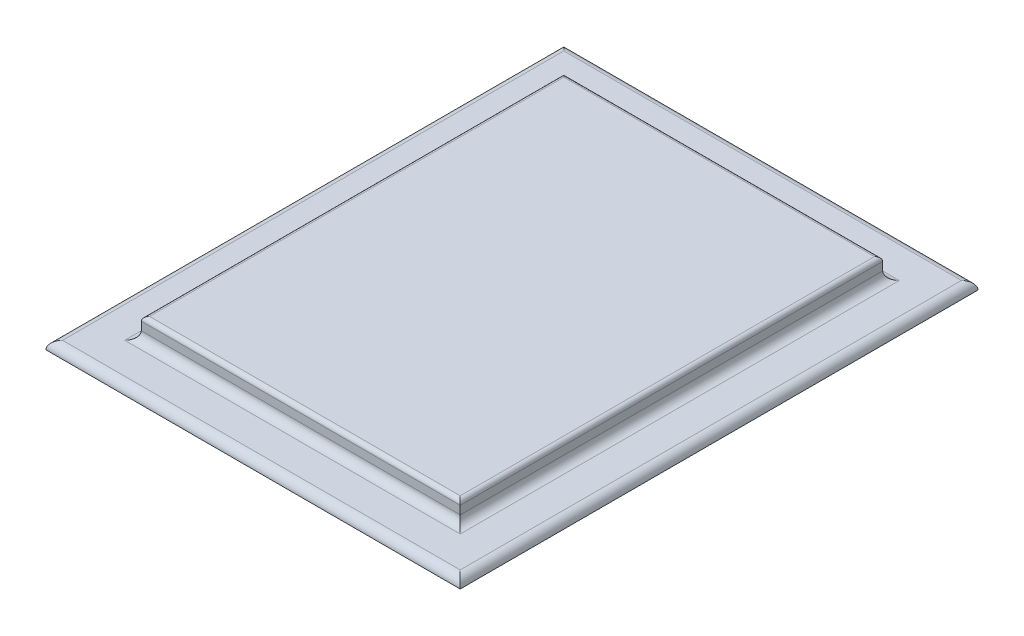
ISO-10303-21;
HEADER;
FILE_DESCRIPTION(('STEP AP214'),'2;1');
FILE_NAME('part.step','',(''),(''),'','','');
FILE_SCHEMA(('AUTOMOTIVE_DESIGN { 1 0 10303 214 1 1 1 1 }'));
ENDSEC;
DATA;
#1=APPLICATION_CONTEXT('core data for automotive mechanical design processes');
#2=APPLICATION_PROTOCOL_DEFINITION('international standard','automotive_design',2000,#1);
#3=PRODUCT_CONTEXT('',#1,'mechanical');
#4=PRODUCT('Part','Part','',(#3));
#5=PRODUCT_RELATED_PRODUCT_CATEGORY('part','',(#4));
#6=PRODUCT_DEFINITION_FORMATION('','',#4);
#7=PRODUCT_DEFINITION_CONTEXT('part definition',#1,'design');
#8=PRODUCT_DEFINITION('design','',#6,#7);
#9=PRODUCT_DEFINITION_SHAPE('','',#8);
#10=(LENGTH_UNIT() NAMED_UNIT(*) SI_UNIT(.MILLI.,.METRE.));
#11=(NAMED_UNIT(*) PLANE_ANGLE_UNIT() SI_UNIT($,.RADIAN.));
#12=(NAMED_UNIT(*) SI_UNIT($,.STERADIAN.) SOLID_ANGLE_UNIT());
#13=UNCERTAINTY_MEASURE_WITH_UNIT(LENGTH_MEASURE(1.E-05),#10,'distance_accuracy_value','');
#14=(GEOMETRIC_REPRESENTATION_CONTEXT(3) GLOBAL_UNCERTAINTY_ASSIGNED_CONTEXT((#13)) GLOBAL_UNIT_ASSIGNED_CONTEXT((#10,
#11,#12)) REPRESENTATION_CONTEXT('',''));
#15=CARTESIAN_POINT('',(0.,0.,0.));
#16=DIRECTION('',(0.,0.,1.));
#17=DIRECTION('',(1.,0.,0.));
#18=AXIS2_PLACEMENT_3D('',#15,#16,#17);
#19=CARTESIAN_POINT('',(0.,0.,0.));
#20=DIRECTION('',(0.,1.,0.));
#21=DIRECTION('',(0.,0.,1.));
#22=AXIS2_PLACEMENT_3D('',#19,#20,#21);
#23=PLANE('',#22);
#24=DIRECTION('',(0.,0.,1.));
#25=VECTOR('',#24,1.);
#26=CARTESIAN_POINT('',(2.38562091503268,0.,-13.1127450980392));
#27=LINE('',#26,#25);
#28=CARTESIAN_POINT('',(2.38562091503268,0.,-13.1127450980392));
#29=VERTEX_POINT('',#28);
#30=CARTESIAN_POINT('',(2.38562091503268,0.,11.8872549019608));
#31=VERTEX_POINT('',#30);
#32=EDGE_CURVE('E205',#29,#31,#27,.T.);
#33=ORIENTED_EDGE('',*,*,#32,.F.);
#34=DIRECTION('',(-1.,0.,0.));
#35=VECTOR('',#34,1.);
#36=CARTESIAN_POINT('',(2.38562091503268,0.,-13.1127450980392));
#37=LINE('',#36,#35);
#38=CARTESIAN_POINT('',(22.3856209150327,0.,-13.1127450980392));
#39=VERTEX_POINT('',#38);
#40=EDGE_CURVE('E213',#39,#29,#37,.T.);
#41=ORIENTED_EDGE('',*,*,#40,.F.);
#42=DIRECTION('',(0.,0.,-1.));
#43=VECTOR('',#42,1.);
#44=CARTESIAN_POINT('',(22.3856209150327,0.,-13.1127450980392));
#45=LINE('',#44,#43);
#46=CARTESIAN_POINT('',(22.3856209150327,0.,11.8872549019608));
#47=VERTEX_POINT('',#46);
#48=EDGE_CURVE('E210',#47,#39,#45,.T.);
#49=ORIENTED_EDGE('',*,*,#48,.F.);
#50=DIRECTION('',(1.,0.,0.));
#51=VECTOR('',#50,1.);
#52=CARTESIAN_POINT('',(2.38562091503268,0.,11.8872549019608));
#53=LINE('',#52,#51);
#54=EDGE_CURVE('E208',#31,#47,#53,.T.);
#55=ORIENTED_EDGE('',*,*,#54,.F.);
#56=EDGE_LOOP('',(#33,#41,#49,#55));
#57=FACE_BOUND('',#56,.T.);
#58=DIRECTION('',(0.,0.,-1.));
#59=VECTOR('',#58,1.);
#60=CARTESIAN_POINT('',(19.8856209150327,0.,9.38725490196079));
#61=LINE('',#60,#59);
#62=CARTESIAN_POINT('',(19.8856209150327,0.,9.38725490196079));
#63=VERTEX_POINT('',#62);
#64=CARTESIAN_POINT('',(19.8856209150327,0.,-10.6127450980392));
#65=VERTEX_POINT('',#64);
#66=EDGE_CURVE('E165',#63,#65,#61,.T.);
#67=ORIENTED_EDGE('',*,*,#66,.T.);
#68=DIRECTION('',(-1.,0.,0.));
#69=VECTOR('',#68,1.);
#70=CARTESIAN_POINT('',(19.8856209150327,0.,-10.6127450980392));
#71=LINE('',#70,#69);
#72=CARTESIAN_POINT('',(4.88562091503269,0.,-10.6127450980392));
#73=VERTEX_POINT('',#72);
#74=EDGE_CURVE('E175',#65,#73,#71,.T.);
#75=ORIENTED_EDGE('',*,*,#74,.T.);
#76=DIRECTION('',(0.,0.,-1.));
#77=VECTOR('',#76,1.);
#78=CARTESIAN_POINT('',(4.88562091503268,0.,9.38725490196078));
#79=LINE('',#78,#77);
#80=CARTESIAN_POINT('',(4.88562091503268,0.,9.38725490196078));
#81=VERTEX_POINT('',#80);
#82=EDGE_CURVE('E181',#81,#73,#79,.T.);
#83=ORIENTED_EDGE('',*,*,#82,.F.);
#84=DIRECTION('',(-1.,0.,0.));
#85=VECTOR('',#84,1.);
#86=CARTESIAN_POINT('',(19.8856209150327,0.,9.38725490196079));
#87=LINE('',#86,#85);
#88=EDGE_CURVE('E184',#63,#81,#87,.T.);
#89=ORIENTED_EDGE('',*,*,#88,.F.);
#90=EDGE_LOOP('',(#67,#75,#83,#89));
#91=FACE_BOUND('',#90,.T.);
#92=ADVANCED_FACE('F32',(#57,#91),#23,.F.);
#93=CARTESIAN_POINT('',(0.,0.4,0.));
#94=DIRECTION('',(0.,1.,0.));
#95=DIRECTION('',(0.,0.,1.));
#96=AXIS2_PLACEMENT_3D('',#93,#94,#95);
#97=PLANE('',#96);
#98=DIRECTION('',(0.,0.,1.));
#99=VECTOR('',#98,1.);
#100=CARTESIAN_POINT('',(2.78562091503268,0.4,11.8872549019608));
#101=LINE('',#100,#99);
#102=CARTESIAN_POINT('',(2.78562091503268,0.4,-12.7127450980392));
#103=VERTEX_POINT('',#102);
#104=CARTESIAN_POINT('',(2.78562091503268,0.4,11.4872549019608));
#105=VERTEX_POINT('',#104);
#106=EDGE_CURVE('E41',#103,#105,#101,.T.);
#107=ORIENTED_EDGE('',*,*,#106,.T.);
#108=DIRECTION('',(1.,0.,0.));
#109=VECTOR('',#108,1.);
#110=CARTESIAN_POINT('',(22.3856209150327,0.4,11.4872549019608));
#111=LINE('',#110,#109);
#112=CARTESIAN_POINT('',(21.9856209150327,0.4,11.4872549019608));
#113=VERTEX_POINT('',#112);
#114=EDGE_CURVE('E11',#105,#113,#111,.T.);
#115=ORIENTED_EDGE('',*,*,#114,.T.);
#116=DIRECTION('',(0.,0.,-1.));
#117=VECTOR('',#116,1.);
#118=CARTESIAN_POINT('',(21.9856209150327,0.4,-13.1127450980392));
#119=LINE('',#118,#117);
#120=CARTESIAN_POINT('',(21.9856209150327,0.4,-12.7127450980392));
#121=VERTEX_POINT('',#120);
#122=EDGE_CURVE('E301',#113,#121,#119,.T.);
#123=ORIENTED_EDGE('',*,*,#122,.T.);
#124=DIRECTION('',(-1.,0.,0.));
#125=VECTOR('',#124,1.);
#126=CARTESIAN_POINT('',(2.38562091503268,0.4,-12.7127450980392));
#127=LINE('',#126,#125);
#128=EDGE_CURVE('E290',#121,#103,#127,.T.);
#129=ORIENTED_EDGE('',*,*,#128,.T.);
#130=EDGE_LOOP('',(#107,#115,#123,#129));
#131=FACE_BOUND('',#130,.T.);
#132=DIRECTION('',(-1.,0.,0.));
#133=VECTOR('',#132,1.);
#134=CARTESIAN_POINT('',(0.,0.4,-11.2127450980392));
#135=LINE('',#134,#133);
#136=CARTESIAN_POINT('',(4.28562091503268,0.4,-11.2127450980392));
#137=VERTEX_POINT('',#136);
#138=CARTESIAN_POINT('',(20.4856209150327,0.4,-11.2127450980392));
#139=VERTEX_POINT('',#138);
#140=EDGE_CURVE('E219',#137,#139,#135,.F.);
#141=ORIENTED_EDGE('',*,*,#140,.T.);
#142=DIRECTION('',(0.,0.,-1.));
#143=VECTOR('',#142,1.);
#144=CARTESIAN_POINT('',(20.4856209150327,0.4,0.));
#145=LINE('',#144,#143);
#146=CARTESIAN_POINT('',(20.4856209150327,0.4,9.98725490196078));
#147=VERTEX_POINT('',#146);
#148=EDGE_CURVE('E225',#139,#147,#145,.F.);
#149=ORIENTED_EDGE('',*,*,#148,.T.);
#150=DIRECTION('',(1.,0.,0.));
#151=VECTOR('',#150,1.);
#152=CARTESIAN_POINT('',(0.,0.4,9.98725490196078));
#153=LINE('',#152,#151);
#154=CARTESIAN_POINT('',(4.28562091503268,0.4,9.98725490196078));
#155=VERTEX_POINT('',#154);
#156=EDGE_CURVE('E223',#147,#155,#153,.F.);
#157=ORIENTED_EDGE('',*,*,#156,.T.);
#158=DIRECTION('',(0.,0.,1.));
#159=VECTOR('',#158,1.);
#160=CARTESIAN_POINT('',(4.28562091503268,0.4,0.));
#161=LINE('',#160,#159);
#162=EDGE_CURVE('E221',#155,#137,#161,.F.);
#163=ORIENTED_EDGE('',*,*,#162,.T.);
#164=EDGE_LOOP('',(#141,#149,#157,#163));
#165=FACE_BOUND('',#164,.T.);
#166=ADVANCED_FACE('F320',(#131,#165),#97,.T.);
#167=CARTESIAN_POINT('',(4.68562091503268,1.4,9.58725490196078));
#168=DIRECTION('',(1.,0.,0.));
#169=DIRECTION('',(0.,0.,-1.));
#170=AXIS2_PLACEMENT_3D('',#167,#168,#169);
#171=PLANE('',#170);
#172=DIRECTION('',(0.,-1.,0.));
#173=VECTOR('',#172,1.);
#174=CARTESIAN_POINT('',(4.68562091503268,1.4,9.58725490196078));
#175=LINE('',#174,#173);
#176=CARTESIAN_POINT('',(4.68562091503268,1.2,9.58725490196078));
#177=VERTEX_POINT('',#176);
#178=CARTESIAN_POINT('',(4.68562091503268,0.8,9.58725490196078));
#179=VERTEX_POINT('',#178);
#180=EDGE_CURVE('E203',#177,#179,#175,.T.);
#181=ORIENTED_EDGE('',*,*,#180,.F.);
#182=DIRECTION('',(0.,0.,1.));
#183=VECTOR('',#182,1.);
#184=CARTESIAN_POINT('',(4.68562091503268,1.2,-10.8127450980392));
#185=LINE('',#184,#183);
#186=CARTESIAN_POINT('',(4.68562091503268,1.2,-10.8127450980392));
#187=VERTEX_POINT('',#186);
#188=EDGE_CURVE('E261',#177,#187,#185,.F.);
#189=ORIENTED_EDGE('',*,*,#188,.T.);
#190=DIRECTION('',(0.,-1.,0.));
#191=VECTOR('',#190,1.);
#192=CARTESIAN_POINT('',(4.68562091503268,1.4,-10.8127450980392));
#193=LINE('',#192,#191);
#194=CARTESIAN_POINT('',(4.68562091503268,0.8,-10.8127450980392));
#195=VERTEX_POINT('',#194);
#196=EDGE_CURVE('E171',#187,#195,#193,.T.);
#197=ORIENTED_EDGE('',*,*,#196,.T.);
#198=DIRECTION('',(0.,0.,1.));
#199=VECTOR('',#198,1.);
#200=CARTESIAN_POINT('',(4.68562091503268,0.8,9.58725490196078));
#201=LINE('',#200,#199);
#202=EDGE_CURVE('E231',#195,#179,#201,.T.);
#203=ORIENTED_EDGE('',*,*,#202,.T.);
#204=EDGE_LOOP('',(#181,#189,#197,#203));
#205=FACE_BOUND('',#204,.T.);
#206=ADVANCED_FACE('F323',(#205),#171,.F.);
#207=CARTESIAN_POINT('',(20.0856209150327,1.4,9.58725490196078));
#208=DIRECTION('',(0.,0.,-1.));
#209=DIRECTION('',(-1.,0.,0.));
#210=AXIS2_PLACEMENT_3D('',#207,#208,#209);
#211=PLANE('',#210);
#212=DIRECTION('',(0.,-1.,0.));
#213=VECTOR('',#212,1.);
#214=CARTESIAN_POINT('',(20.0856209150327,1.4,9.58725490196078));
#215=LINE('',#214,#213);
#216=CARTESIAN_POINT('',(20.0856209150327,1.2,9.58725490196078));
#217=VERTEX_POINT('',#216);
#218=CARTESIAN_POINT('',(20.0856209150327,0.8,9.58725490196078));
#219=VERTEX_POINT('',#218);
#220=EDGE_CURVE('E201',#217,#219,#215,.T.);
#221=ORIENTED_EDGE('',*,*,#220,.F.);
#222=DIRECTION('',(1.,0.,0.));
#223=VECTOR('',#222,1.);
#224=CARTESIAN_POINT('',(4.68562091503268,1.2,9.58725490196078));
#225=LINE('',#224,#223);
#226=EDGE_CURVE('E259',#217,#177,#225,.F.);
#227=ORIENTED_EDGE('',*,*,#226,.T.);
#228=ORIENTED_EDGE('',*,*,#180,.T.);
#229=DIRECTION('',(1.,0.,0.));
#230=VECTOR('',#229,1.);
#231=CARTESIAN_POINT('',(20.0856209150327,0.8,9.58725490196078));
#232=LINE('',#231,#230);
#233=EDGE_CURVE('E228',#179,#219,#232,.T.);
#234=ORIENTED_EDGE('',*,*,#233,.T.);
#235=EDGE_LOOP('',(#221,#227,#228,#234));
#236=FACE_BOUND('',#235,.T.);
#237=ADVANCED_FACE('F349',(#236),#211,.F.);
#238=CARTESIAN_POINT('',(20.0856209150327,1.4,9.58725490196078));
#239=DIRECTION('',(-1.,0.,0.));
#240=DIRECTION('',(0.,0.,1.));
#241=AXIS2_PLACEMENT_3D('',#238,#239,#240);
#242=PLANE('',#241);
#243=DIRECTION('',(0.,-1.,0.));
#244=VECTOR('',#243,1.);
#245=CARTESIAN_POINT('',(20.0856209150327,1.4,-10.8127450980392));
#246=LINE('',#245,#244);
#247=CARTESIAN_POINT('',(20.0856209150327,1.2,-10.8127450980392));
#248=VERTEX_POINT('',#247);
#249=CARTESIAN_POINT('',(20.0856209150327,0.8,-10.8127450980392));
#250=VERTEX_POINT('',#249);
#251=EDGE_CURVE('E199',#248,#250,#246,.T.);
#252=ORIENTED_EDGE('',*,*,#251,.F.);
#253=DIRECTION('',(0.,0.,-1.));
#254=VECTOR('',#253,1.);
#255=CARTESIAN_POINT('',(20.0856209150327,1.2,9.58725490196078));
#256=LINE('',#255,#254);
#257=EDGE_CURVE('E257',#248,#217,#256,.F.);
#258=ORIENTED_EDGE('',*,*,#257,.T.);
#259=ORIENTED_EDGE('',*,*,#220,.T.);
#260=DIRECTION('',(0.,0.,-1.));
#261=VECTOR('',#260,1.);
#262=CARTESIAN_POINT('',(20.0856209150327,0.8,9.58725490196078));
#263=LINE('',#262,#261);
#264=EDGE_CURVE('E216',#219,#250,#263,.T.);
#265=ORIENTED_EDGE('',*,*,#264,.T.);
#266=EDGE_LOOP('',(#252,#258,#259,#265));
#267=FACE_BOUND('',#266,.T.);
#268=ADVANCED_FACE('F343',(#267),#242,.F.);
#269=CARTESIAN_POINT('',(20.0856209150327,1.4,-10.8127450980392));
#270=DIRECTION('',(0.,0.,1.));
#271=DIRECTION('',(1.,0.,0.));
#272=AXIS2_PLACEMENT_3D('',#269,#270,#271);
#273=PLANE('',#272);
#274=ORIENTED_EDGE('',*,*,#196,.F.);
#275=DIRECTION('',(-1.,0.,0.));
#276=VECTOR('',#275,1.);
#277=CARTESIAN_POINT('',(20.0856209150327,1.2,-10.8127450980392));
#278=LINE('',#277,#276);
#279=EDGE_CURVE('E254',#187,#248,#278,.F.);
#280=ORIENTED_EDGE('',*,*,#279,.T.);
#281=ORIENTED_EDGE('',*,*,#251,.T.);
#282=DIRECTION('',(-1.,0.,0.));
#283=VECTOR('',#282,1.);
#284=CARTESIAN_POINT('',(20.0856209150327,0.8,-10.8127450980392));
#285=LINE('',#284,#283);
#286=EDGE_CURVE('E234',#250,#195,#285,.T.);
#287=ORIENTED_EDGE('',*,*,#286,.T.);
#288=EDGE_LOOP('',(#274,#280,#281,#287));
#289=FACE_BOUND('',#288,.T.);
#290=ADVANCED_FACE('F360',(#289),#273,.F.);
#291=CARTESIAN_POINT('',(0.,1.4,0.));
#292=DIRECTION('',(0.,1.,0.));
#293=DIRECTION('',(0.,0.,1.));
#294=AXIS2_PLACEMENT_3D('',#291,#292,#293);
#295=PLANE('',#294);
#296=DIRECTION('',(0.,0.,-1.));
#297=VECTOR('',#296,1.);
#298=CARTESIAN_POINT('',(19.8856209150327,1.4,-10.8127450980392));
#299=LINE('',#298,#297);
#300=CARTESIAN_POINT('',(19.8856209150327,1.4,9.38725490196078));
#301=VERTEX_POINT('',#300);
#302=CARTESIAN_POINT('',(19.8856209150327,1.4,-10.6127450980392));
#303=VERTEX_POINT('',#302);
#304=EDGE_CURVE('E249',#301,#303,#299,.T.);
#305=ORIENTED_EDGE('',*,*,#304,.T.);
#306=DIRECTION('',(-1.,0.,0.));
#307=VECTOR('',#306,1.);
#308=CARTESIAN_POINT('',(4.68562091503268,1.4,-10.6127450980392));
#309=LINE('',#308,#307);
#310=CARTESIAN_POINT('',(4.88562091503268,1.4,-10.6127450980392));
#311=VERTEX_POINT('',#310);
#312=EDGE_CURVE('E251',#303,#311,#309,.T.);
#313=ORIENTED_EDGE('',*,*,#312,.T.);
#314=DIRECTION('',(0.,0.,1.));
#315=VECTOR('',#314,1.);
#316=CARTESIAN_POINT('',(4.88562091503268,1.4,9.58725490196078));
#317=LINE('',#316,#315);
#318=CARTESIAN_POINT('',(4.88562091503268,1.4,9.38725490196078));
#319=VERTEX_POINT('',#318);
#320=EDGE_CURVE('E237',#311,#319,#317,.T.);
#321=ORIENTED_EDGE('',*,*,#320,.T.);
#322=DIRECTION('',(1.,0.,0.));
#323=VECTOR('',#322,1.);
#324=CARTESIAN_POINT('',(20.0856209150327,1.4,9.38725490196078));
#325=LINE('',#324,#323);
#326=EDGE_CURVE('E247',#319,#301,#325,.T.);
#327=ORIENTED_EDGE('',*,*,#326,.T.);
#328=EDGE_LOOP('',(#305,#313,#321,#327));
#329=FACE_BOUND('',#328,.T.);
#330=ADVANCED_FACE('F371',(#329),#295,.T.);
#331=CARTESIAN_POINT('',(19.8856209150327,1.,9.38725490196079));
#332=DIRECTION('',(-1.,0.,0.));
#333=DIRECTION('',(0.,0.,1.));
#334=AXIS2_PLACEMENT_3D('',#331,#332,#333);
#335=PLANE('',#334);
#336=DIRECTION('',(0.,-1.,0.));
#337=VECTOR('',#336,1.);
#338=CARTESIAN_POINT('',(19.8856209150327,1.,9.38725490196079));
#339=LINE('',#338,#337);
#340=CARTESIAN_POINT('',(19.8856209150327,0.5,9.38725490196079));
#341=VERTEX_POINT('',#340);
#342=EDGE_CURVE('E193',#341,#63,#339,.T.);
#343=ORIENTED_EDGE('',*,*,#342,.F.);
#344=DIRECTION('',(0.,0.,-1.));
#345=VECTOR('',#344,1.);
#346=CARTESIAN_POINT('',(19.8856209150327,0.5,9.38725490196079));
#347=LINE('',#346,#345);
#348=CARTESIAN_POINT('',(19.8856209150327,0.5,-10.6127450980392));
#349=VERTEX_POINT('',#348);
#350=EDGE_CURVE('E168',#341,#349,#347,.T.);
#351=ORIENTED_EDGE('',*,*,#350,.T.);
#352=DIRECTION('',(0.,-1.,0.));
#353=VECTOR('',#352,1.);
#354=CARTESIAN_POINT('',(19.8856209150327,1.,-10.6127450980392));
#355=LINE('',#354,#353);
#356=EDGE_CURVE('E160',#349,#65,#355,.T.);
#357=ORIENTED_EDGE('',*,*,#356,.T.);
#358=ORIENTED_EDGE('',*,*,#66,.F.);
#359=EDGE_LOOP('',(#343,#351,#357,#358));
#360=FACE_BOUND('',#359,.T.);
#361=ADVANCED_FACE('F163',(#360),#335,.T.);
#362=CARTESIAN_POINT('',(19.8856209150327,1.,-10.6127450980392));
#363=DIRECTION('',(0.,0.,1.));
#364=DIRECTION('',(1.,0.,0.));
#365=AXIS2_PLACEMENT_3D('',#362,#363,#364);
#366=PLANE('',#365);
#367=ORIENTED_EDGE('',*,*,#356,.F.);
#368=DIRECTION('',(-1.,0.,0.));
#369=VECTOR('',#368,1.);
#370=CARTESIAN_POINT('',(19.8856209150327,0.5,-10.6127450980392));
#371=LINE('',#370,#369);
#372=CARTESIAN_POINT('',(4.88562091503269,0.5,-10.6127450980392));
#373=VERTEX_POINT('',#372);
#374=EDGE_CURVE('E288',#349,#373,#371,.T.);
#375=ORIENTED_EDGE('',*,*,#374,.T.);
#376=DIRECTION('',(0.,-1.,0.));
#377=VECTOR('',#376,1.);
#378=CARTESIAN_POINT('',(4.88562091503269,1.,-10.6127450980392));
#379=LINE('',#378,#377);
#380=EDGE_CURVE('E172',#373,#73,#379,.T.);
#381=ORIENTED_EDGE('',*,*,#380,.T.);
#382=ORIENTED_EDGE('',*,*,#74,.F.);
#383=EDGE_LOOP('',(#367,#375,#381,#382));
#384=FACE_BOUND('',#383,.T.);
#385=ADVANCED_FACE('F176',(#384),#366,.T.);
#386=CARTESIAN_POINT('',(4.88562091503268,1.,9.38725490196078));
#387=DIRECTION('',(-1.,0.,0.));
#388=DIRECTION('',(0.,0.,1.));
#389=AXIS2_PLACEMENT_3D('',#386,#387,#388);
#390=PLANE('',#389);
#391=ORIENTED_EDGE('',*,*,#380,.F.);
#392=DIRECTION('',(0.,0.,-1.));
#393=VECTOR('',#392,1.);
#394=CARTESIAN_POINT('',(4.88562091503268,0.5,9.38725490196078));
#395=LINE('',#394,#393);
#396=CARTESIAN_POINT('',(4.88562091503268,0.5,9.38725490196078));
#397=VERTEX_POINT('',#396);
#398=EDGE_CURVE('E286',#373,#397,#395,.F.);
#399=ORIENTED_EDGE('',*,*,#398,.T.);
#400=DIRECTION('',(0.,-1.,0.));
#401=VECTOR('',#400,1.);
#402=CARTESIAN_POINT('',(4.88562091503268,1.,9.38725490196078));
#403=LINE('',#402,#401);
#404=EDGE_CURVE('E195',#397,#81,#403,.T.);
#405=ORIENTED_EDGE('',*,*,#404,.T.);
#406=ORIENTED_EDGE('',*,*,#82,.T.);
#407=EDGE_LOOP('',(#391,#399,#405,#406));
#408=FACE_BOUND('',#407,.T.);
#409=ADVANCED_FACE('F533',(#408),#390,.F.);
#410=CARTESIAN_POINT('',(19.8856209150327,1.,9.38725490196079));
#411=DIRECTION('',(0.,0.,1.));
#412=DIRECTION('',(1.,0.,0.));
#413=AXIS2_PLACEMENT_3D('',#410,#411,#412);
#414=PLANE('',#413);
#415=ORIENTED_EDGE('',*,*,#404,.F.);
#416=DIRECTION('',(-1.,0.,0.));
#417=VECTOR('',#416,1.);
#418=CARTESIAN_POINT('',(19.8856209150327,0.5,9.38725490196079));
#419=LINE('',#418,#417);
#420=EDGE_CURVE('E282',#397,#341,#419,.F.);
#421=ORIENTED_EDGE('',*,*,#420,.T.);
#422=ORIENTED_EDGE('',*,*,#342,.T.);
#423=ORIENTED_EDGE('',*,*,#88,.T.);
#424=EDGE_LOOP('',(#415,#421,#422,#423));
#425=FACE_BOUND('',#424,.T.);
#426=ADVANCED_FACE('F524',(#425),#414,.F.);
#427=CARTESIAN_POINT('',(0.,1.,0.));
#428=DIRECTION('',(0.,1.,0.));
#429=DIRECTION('',(0.,0.,1.));
#430=AXIS2_PLACEMENT_3D('',#427,#428,#429);
#431=PLANE('',#430);
#432=DIRECTION('',(0.,0.,-1.));
#433=VECTOR('',#432,1.);
#434=CARTESIAN_POINT('',(19.3856209150327,1.,0.));
#435=LINE('',#434,#433);
#436=CARTESIAN_POINT('',(19.3856209150327,1.,-10.1127450980392));
#437=VERTEX_POINT('',#436);
#438=CARTESIAN_POINT('',(19.3856209150327,1.,8.88725490196078));
#439=VERTEX_POINT('',#438);
#440=EDGE_CURVE('E277',#437,#439,#435,.F.);
#441=ORIENTED_EDGE('',*,*,#440,.T.);
#442=DIRECTION('',(-1.,0.,0.));
#443=VECTOR('',#442,1.);
#444=CARTESIAN_POINT('',(4.88562091503268,1.,8.88725490196078));
#445=LINE('',#444,#443);
#446=CARTESIAN_POINT('',(5.38562091503268,1.,8.88725490196078));
#447=VERTEX_POINT('',#446);
#448=EDGE_CURVE('E279',#439,#447,#445,.T.);
#449=ORIENTED_EDGE('',*,*,#448,.T.);
#450=DIRECTION('',(0.,0.,-1.));
#451=VECTOR('',#450,1.);
#452=CARTESIAN_POINT('',(5.38562091503268,1.,-10.6127450980392));
#453=LINE('',#452,#451);
#454=CARTESIAN_POINT('',(5.38562091503268,1.,-10.1127450980392));
#455=VERTEX_POINT('',#454);
#456=EDGE_CURVE('E275',#447,#455,#453,.T.);
#457=ORIENTED_EDGE('',*,*,#456,.T.);
#458=DIRECTION('',(-1.,0.,0.));
#459=VECTOR('',#458,1.);
#460=CARTESIAN_POINT('',(0.,1.,-10.1127450980392));
#461=LINE('',#460,#459);
#462=EDGE_CURVE('E263',#455,#437,#461,.F.);
#463=ORIENTED_EDGE('',*,*,#462,.T.);
#464=EDGE_LOOP('',(#441,#449,#457,#463));
#465=FACE_BOUND('',#464,.T.);
#466=ADVANCED_FACE('F399',(#465),#431,.F.);
#467=CARTESIAN_POINT('',(4.28562091503268,0.8,9.58725490196078));
#468=DIRECTION('',(0.,0.,1.));
#469=DIRECTION('',(1.,0.,0.));
#470=AXIS2_PLACEMENT_3D('',#467,#468,#469);
#471=CYLINDRICAL_SURFACE('',#470,0.4);
#472=CARTESIAN_POINT('',(4.28562091503269,0.8,-11.2127450980392));
#473=DIRECTION('',(-0.707106781186547,0.,0.707106781186548));
#474=DIRECTION('',(-0.707106781186548,0.,-0.707106781186547));
#475=AXIS2_PLACEMENT_3D('',#472,#473,#474);
#476=ELLIPSE('',#475,0.565685424949238,0.4);
#477=EDGE_CURVE('E188',#137,#195,#476,.T.);
#478=ORIENTED_EDGE('',*,*,#477,.F.);
#479=ORIENTED_EDGE('',*,*,#162,.F.);
#480=CARTESIAN_POINT('',(4.28562091503269,0.8,9.98725490196078));
#481=DIRECTION('',(0.707106781186548,0.,0.707106781186547));
#482=DIRECTION('',(-0.707106781186547,0.,0.707106781186548));
#483=AXIS2_PLACEMENT_3D('',#480,#481,#482);
#484=ELLIPSE('',#483,0.565685424949238,0.4);
#485=EDGE_CURVE('E185',#179,#155,#484,.F.);
#486=ORIENTED_EDGE('',*,*,#485,.F.);
#487=ORIENTED_EDGE('',*,*,#202,.F.);
#488=EDGE_LOOP('',(#478,#479,#486,#487));
#489=FACE_BOUND('',#488,.T.);
#490=ADVANCED_FACE('F355',(#489),#471,.F.);
#491=CARTESIAN_POINT('',(20.0856209150327,0.8,9.98725490196078));
#492=DIRECTION('',(1.,0.,0.));
#493=DIRECTION('',(0.,0.,-1.));
#494=AXIS2_PLACEMENT_3D('',#491,#492,#493);
#495=CYLINDRICAL_SURFACE('',#494,0.4);
#496=ORIENTED_EDGE('',*,*,#485,.T.);
#497=ORIENTED_EDGE('',*,*,#156,.F.);
#498=CARTESIAN_POINT('',(20.4856209150327,0.8,9.98725490196078));
#499=DIRECTION('',(0.707106781186547,0.,-0.707106781186548));
#500=DIRECTION('',(0.707106781186548,0.,0.707106781186547));
#501=AXIS2_PLACEMENT_3D('',#498,#499,#500);
#502=ELLIPSE('',#501,0.565685424949238,0.4);
#503=EDGE_CURVE('E241',#219,#147,#502,.F.);
#504=ORIENTED_EDGE('',*,*,#503,.F.);
#505=ORIENTED_EDGE('',*,*,#233,.F.);
#506=EDGE_LOOP('',(#496,#497,#504,#505));
#507=FACE_BOUND('',#506,.T.);
#508=ADVANCED_FACE('F352',(#507),#495,.F.);
#509=CARTESIAN_POINT('',(20.0856209150327,0.8,-11.2127450980392));
#510=DIRECTION('',(-1.,0.,0.));
#511=DIRECTION('',(0.,0.,1.));
#512=AXIS2_PLACEMENT_3D('',#509,#510,#511);
#513=CYLINDRICAL_SURFACE('',#512,0.4);
#514=ORIENTED_EDGE('',*,*,#477,.T.);
#515=ORIENTED_EDGE('',*,*,#286,.F.);
#516=CARTESIAN_POINT('',(20.4856209150327,0.8,-11.2127450980392));
#517=DIRECTION('',(-0.707106781186548,0.,-0.707106781186547));
#518=DIRECTION('',(-0.707106781186547,0.,0.707106781186548));
#519=AXIS2_PLACEMENT_3D('',#516,#517,#518);
#520=ELLIPSE('',#519,0.565685424949238,0.4);
#521=EDGE_CURVE('E238',#139,#250,#520,.T.);
#522=ORIENTED_EDGE('',*,*,#521,.F.);
#523=ORIENTED_EDGE('',*,*,#140,.F.);
#524=EDGE_LOOP('',(#514,#515,#522,#523));
#525=FACE_BOUND('',#524,.T.);
#526=ADVANCED_FACE('F337',(#525),#513,.F.);
#527=CARTESIAN_POINT('',(20.4856209150327,0.8,9.58725490196078));
#528=DIRECTION('',(0.,0.,-1.));
#529=DIRECTION('',(-1.,0.,0.));
#530=AXIS2_PLACEMENT_3D('',#527,#528,#529);
#531=CYLINDRICAL_SURFACE('',#530,0.4);
#532=ORIENTED_EDGE('',*,*,#503,.T.);
#533=ORIENTED_EDGE('',*,*,#148,.F.);
#534=ORIENTED_EDGE('',*,*,#521,.T.);
#535=ORIENTED_EDGE('',*,*,#264,.F.);
#536=EDGE_LOOP('',(#532,#533,#534,#535));
#537=FACE_BOUND('',#536,.T.);
#538=ADVANCED_FACE('F332',(#537),#531,.F.);
#539=CARTESIAN_POINT('',(0.,1.2,9.38725490196078));
#540=DIRECTION('',(-1.,0.,0.));
#541=DIRECTION('',(0.,0.,1.));
#542=AXIS2_PLACEMENT_3D('',#539,#540,#541);
#543=CYLINDRICAL_SURFACE('',#542,0.2);
#544=CARTESIAN_POINT('',(4.88562091503268,1.2,9.38725490196078));
#545=DIRECTION('',(-0.707106781186548,0.,-0.707106781186547));
#546=DIRECTION('',(0.707106781186547,0.,-0.707106781186548));
#547=AXIS2_PLACEMENT_3D('',#544,#545,#546);
#548=ELLIPSE('',#547,0.282842712474619,0.2);
#549=EDGE_CURVE('E269',#177,#319,#548,.T.);
#550=ORIENTED_EDGE('',*,*,#549,.F.);
#551=ORIENTED_EDGE('',*,*,#226,.F.);
#552=CARTESIAN_POINT('',(19.8856209150327,1.2,9.38725490196078));
#553=DIRECTION('',(-0.707106781186547,0.,0.707106781186548));
#554=DIRECTION('',(-0.707106781186548,0.,-0.707106781186547));
#555=AXIS2_PLACEMENT_3D('',#552,#553,#554);
#556=ELLIPSE('',#555,0.282842712474619,0.2);
#557=EDGE_CURVE('E242',#301,#217,#556,.F.);
#558=ORIENTED_EDGE('',*,*,#557,.F.);
#559=ORIENTED_EDGE('',*,*,#326,.F.);
#560=EDGE_LOOP('',(#550,#551,#558,#559));
#561=FACE_BOUND('',#560,.T.);
#562=ADVANCED_FACE('F377',(#561),#543,.T.);
#563=CARTESIAN_POINT('',(19.8856209150327,1.2,0.));
#564=DIRECTION('',(0.,0.,1.));
#565=DIRECTION('',(1.,0.,0.));
#566=AXIS2_PLACEMENT_3D('',#563,#564,#565);
#567=CYLINDRICAL_SURFACE('',#566,0.2);
#568=ORIENTED_EDGE('',*,*,#557,.T.);
#569=ORIENTED_EDGE('',*,*,#257,.F.);
#570=CARTESIAN_POINT('',(19.8856209150327,1.2,-10.6127450980392));
#571=DIRECTION('',(0.707106781186548,0.,0.707106781186547));
#572=DIRECTION('',(-0.707106781186547,0.,0.707106781186548));
#573=AXIS2_PLACEMENT_3D('',#570,#571,#572);
#574=ELLIPSE('',#573,0.282842712474619,0.2);
#575=EDGE_CURVE('E266',#303,#248,#574,.F.);
#576=ORIENTED_EDGE('',*,*,#575,.F.);
#577=ORIENTED_EDGE('',*,*,#304,.F.);
#578=EDGE_LOOP('',(#568,#569,#576,#577));
#579=FACE_BOUND('',#578,.T.);
#580=ADVANCED_FACE('F375',(#579),#567,.T.);
#581=CARTESIAN_POINT('',(4.88562091503268,1.2,0.));
#582=DIRECTION('',(0.,0.,-1.));
#583=DIRECTION('',(-1.,0.,0.));
#584=AXIS2_PLACEMENT_3D('',#581,#582,#583);
#585=CYLINDRICAL_SURFACE('',#584,0.2);
#586=ORIENTED_EDGE('',*,*,#549,.T.);
#587=ORIENTED_EDGE('',*,*,#320,.F.);
#588=CARTESIAN_POINT('',(4.88562091503268,1.2,-10.6127450980392));
#589=DIRECTION('',(0.707106781186547,0.,-0.707106781186548));
#590=DIRECTION('',(-0.707106781186548,0.,-0.707106781186547));
#591=AXIS2_PLACEMENT_3D('',#588,#589,#590);
#592=ELLIPSE('',#591,0.282842712474619,0.2);
#593=EDGE_CURVE('E264',#187,#311,#592,.T.);
#594=ORIENTED_EDGE('',*,*,#593,.F.);
#595=ORIENTED_EDGE('',*,*,#188,.F.);
#596=EDGE_LOOP('',(#586,#587,#594,#595));
#597=FACE_BOUND('',#596,.T.);
#598=ADVANCED_FACE('F368',(#597),#585,.T.);
#599=CARTESIAN_POINT('',(0.,1.2,-10.6127450980392));
#600=DIRECTION('',(1.,0.,0.));
#601=DIRECTION('',(0.,0.,-1.));
#602=AXIS2_PLACEMENT_3D('',#599,#600,#601);
#603=CYLINDRICAL_SURFACE('',#602,0.2);
#604=ORIENTED_EDGE('',*,*,#575,.T.);
#605=ORIENTED_EDGE('',*,*,#279,.F.);
#606=ORIENTED_EDGE('',*,*,#593,.T.);
#607=ORIENTED_EDGE('',*,*,#312,.F.);
#608=EDGE_LOOP('',(#604,#605,#606,#607));
#609=FACE_BOUND('',#608,.T.);
#610=ADVANCED_FACE('F363',(#609),#603,.T.);
#611=CARTESIAN_POINT('',(19.8856209150327,0.5,-10.1127450980392));
#612=DIRECTION('',(-1.,0.,0.));
#613=DIRECTION('',(0.,0.,1.));
#614=AXIS2_PLACEMENT_3D('',#611,#612,#613);
#615=CYLINDRICAL_SURFACE('',#614,0.5);
#616=CARTESIAN_POINT('',(5.38562091503269,0.5,-10.1127450980392));
#617=DIRECTION('',(-0.707106781186548,0.,0.707106781186547));
#618=DIRECTION('',(0.707106781186547,0.,0.707106781186548));
#619=AXIS2_PLACEMENT_3D('',#616,#617,#618);
#620=ELLIPSE('',#619,0.707106781186547,0.5);
#621=EDGE_CURVE('E295',#373,#455,#620,.F.);
#622=ORIENTED_EDGE('',*,*,#621,.F.);
#623=ORIENTED_EDGE('',*,*,#374,.F.);
#624=CARTESIAN_POINT('',(19.3856209150327,0.5,-10.1127450980392));
#625=DIRECTION('',(-0.707106781186548,0.,-0.707106781186547));
#626=DIRECTION('',(0.707106781186547,0.,-0.707106781186548));
#627=AXIS2_PLACEMENT_3D('',#624,#625,#626);
#628=ELLIPSE('',#627,0.707106781186547,0.5);
#629=EDGE_CURVE('E267',#437,#349,#628,.T.);
#630=ORIENTED_EDGE('',*,*,#629,.F.);
#631=ORIENTED_EDGE('',*,*,#462,.F.);
#632=EDGE_LOOP('',(#622,#623,#630,#631));
#633=FACE_BOUND('',#632,.T.);
#634=ADVANCED_FACE('F402',(#633),#615,.F.);
#635=CARTESIAN_POINT('',(19.3856209150327,0.5,9.38725490196079));
#636=DIRECTION('',(0.,0.,-1.));
#637=DIRECTION('',(-1.,0.,0.));
#638=AXIS2_PLACEMENT_3D('',#635,#636,#637);
#639=CYLINDRICAL_SURFACE('',#638,0.5);
#640=ORIENTED_EDGE('',*,*,#629,.T.);
#641=ORIENTED_EDGE('',*,*,#350,.F.);
#642=CARTESIAN_POINT('',(19.3856209150327,0.5,8.88725490196078));
#643=DIRECTION('',(0.707106781186547,0.,-0.707106781186547));
#644=DIRECTION('',(0.707106781186547,0.,0.707106781186547));
#645=AXIS2_PLACEMENT_3D('',#642,#643,#644);
#646=ELLIPSE('',#645,0.707106781186548,0.5);
#647=EDGE_CURVE('E293',#439,#341,#646,.T.);
#648=ORIENTED_EDGE('',*,*,#647,.F.);
#649=ORIENTED_EDGE('',*,*,#440,.F.);
#650=EDGE_LOOP('',(#640,#641,#648,#649));
#651=FACE_BOUND('',#650,.T.);
#652=ADVANCED_FACE('F419',(#651),#639,.F.);
#653=CARTESIAN_POINT('',(5.38562091503268,0.5,0.));
#654=DIRECTION('',(0.,0.,1.));
#655=DIRECTION('',(1.,0.,0.));
#656=AXIS2_PLACEMENT_3D('',#653,#654,#655);
#657=CYLINDRICAL_SURFACE('',#656,0.5);
#658=ORIENTED_EDGE('',*,*,#621,.T.);
#659=ORIENTED_EDGE('',*,*,#456,.F.);
#660=CARTESIAN_POINT('',(5.38562091503268,0.5,8.88725490196078));
#661=DIRECTION('',(0.707106781186547,0.,0.707106781186548));
#662=DIRECTION('',(0.707106781186548,0.,-0.707106781186547));
#663=AXIS2_PLACEMENT_3D('',#660,#661,#662);
#664=ELLIPSE('',#663,0.707106781186547,0.5);
#665=EDGE_CURVE('E291',#397,#447,#664,.F.);
#666=ORIENTED_EDGE('',*,*,#665,.F.);
#667=ORIENTED_EDGE('',*,*,#398,.F.);
#668=EDGE_LOOP('',(#658,#659,#666,#667));
#669=FACE_BOUND('',#668,.T.);
#670=ADVANCED_FACE('F428',(#669),#657,.F.);
#671=CARTESIAN_POINT('',(0.,0.5,8.88725490196078));
#672=DIRECTION('',(1.,0.,0.));
#673=DIRECTION('',(0.,0.,-1.));
#674=AXIS2_PLACEMENT_3D('',#671,#672,#673);
#675=CYLINDRICAL_SURFACE('',#674,0.5);
#676=ORIENTED_EDGE('',*,*,#647,.T.);
#677=ORIENTED_EDGE('',*,*,#420,.F.);
#678=ORIENTED_EDGE('',*,*,#665,.T.);
#679=ORIENTED_EDGE('',*,*,#448,.F.);
#680=EDGE_LOOP('',(#676,#677,#678,#679));
#681=FACE_BOUND('',#680,.T.);
#682=ADVANCED_FACE('F436',(#681),#675,.F.);
#683=CARTESIAN_POINT('',(0.,0.,-12.7127450980392));
#684=DIRECTION('',(1.,0.,0.));
#685=DIRECTION('',(0.,0.,-1.));
#686=AXIS2_PLACEMENT_3D('',#683,#684,#685);
#687=CYLINDRICAL_SURFACE('',#686,0.4);
#688=CARTESIAN_POINT('',(21.9856209150327,0.,-12.7127450980392));
#689=DIRECTION('',(0.707106781186548,0.,0.707106781186547));
#690=DIRECTION('',(0.707106781186547,0.,-0.707106781186547));
#691=AXIS2_PLACEMENT_3D('',#688,#689,#690);
#692=ELLIPSE('',#691,0.565685424949238,0.4);
#693=EDGE_CURVE('E306',#39,#121,#692,.T.);
#694=ORIENTED_EDGE('',*,*,#693,.F.);
#695=ORIENTED_EDGE('',*,*,#40,.T.);
#696=CARTESIAN_POINT('',(2.78562091503268,0.,-12.7127450980392));
#697=DIRECTION('',(0.707106781186547,0.,-0.707106781186547));
#698=DIRECTION('',(0.707106781186548,0.,0.707106781186547));
#699=AXIS2_PLACEMENT_3D('',#696,#697,#698);
#700=ELLIPSE('',#699,0.565685424949238,0.4);
#701=EDGE_CURVE('E36',#103,#29,#700,.F.);
#702=ORIENTED_EDGE('',*,*,#701,.F.);
#703=ORIENTED_EDGE('',*,*,#128,.F.);
#704=EDGE_LOOP('',(#694,#695,#702,#703));
#705=FACE_BOUND('',#704,.T.);
#706=ADVANCED_FACE('F34',(#705),#687,.T.);
#707=CARTESIAN_POINT('',(2.78562091503268,0.,0.));
#708=DIRECTION('',(0.,0.,-1.));
#709=DIRECTION('',(-1.,0.,0.));
#710=AXIS2_PLACEMENT_3D('',#707,#708,#709);
#711=CYLINDRICAL_SURFACE('',#710,0.4);
#712=ORIENTED_EDGE('',*,*,#701,.T.);
#713=ORIENTED_EDGE('',*,*,#32,.T.);
#714=CARTESIAN_POINT('',(2.78562091503268,0.,11.4872549019608));
#715=DIRECTION('',(-0.707106781186547,0.,-0.707106781186547));
#716=DIRECTION('',(0.707106781186547,0.,-0.707106781186547));
#717=AXIS2_PLACEMENT_3D('',#714,#715,#716);
#718=ELLIPSE('',#717,0.565685424949238,0.4);
#719=EDGE_CURVE('E305',#105,#31,#718,.F.);
#720=ORIENTED_EDGE('',*,*,#719,.F.);
#721=ORIENTED_EDGE('',*,*,#106,.F.);
#722=EDGE_LOOP('',(#712,#713,#720,#721));
#723=FACE_BOUND('',#722,.T.);
#724=ADVANCED_FACE('F313',(#723),#711,.T.);
#725=CARTESIAN_POINT('',(21.9856209150327,0.,0.));
#726=DIRECTION('',(0.,0.,1.));
#727=DIRECTION('',(1.,0.,0.));
#728=AXIS2_PLACEMENT_3D('',#725,#726,#727);
#729=CYLINDRICAL_SURFACE('',#728,0.4);
#730=ORIENTED_EDGE('',*,*,#693,.T.);
#731=ORIENTED_EDGE('',*,*,#122,.F.);
#732=CARTESIAN_POINT('',(21.9856209150327,0.,11.4872549019608));
#733=DIRECTION('',(-0.707106781186547,0.,0.707106781186547));
#734=DIRECTION('',(0.707106781186547,0.,0.707106781186547));
#735=AXIS2_PLACEMENT_3D('',#732,#733,#734);
#736=ELLIPSE('',#735,0.565685424949238,0.4);
#737=EDGE_CURVE('E55',#47,#113,#736,.T.);
#738=ORIENTED_EDGE('',*,*,#737,.F.);
#739=ORIENTED_EDGE('',*,*,#48,.T.);
#740=EDGE_LOOP('',(#730,#731,#738,#739));
#741=FACE_BOUND('',#740,.T.);
#742=ADVANCED_FACE('F319',(#741),#729,.T.);
#743=CARTESIAN_POINT('',(0.,0.,11.4872549019608));
#744=DIRECTION('',(-1.,0.,0.));
#745=DIRECTION('',(0.,0.,1.));
#746=AXIS2_PLACEMENT_3D('',#743,#744,#745);
#747=CYLINDRICAL_SURFACE('',#746,0.4);
#748=ORIENTED_EDGE('',*,*,#719,.T.);
#749=ORIENTED_EDGE('',*,*,#54,.T.);
#750=ORIENTED_EDGE('',*,*,#737,.T.);
#751=ORIENTED_EDGE('',*,*,#114,.F.);
#752=EDGE_LOOP('',(#748,#749,#750,#751));
#753=FACE_BOUND('',#752,.T.);
#754=ADVANCED_FACE('F318',(#753),#747,.T.);
#755=CLOSED_SHELL('',(#92,#166,#206,#237,#268,#290,#330,#361,#385,#409,#426,#466,#490,#508,#526,
#538,#562,#580,#598,#610,#634,#652,#670,#682,#706,#724,#742,#754));
#756=MANIFOLD_SOLID_BREP('B2',#755);
#757=ADVANCED_BREP_SHAPE_REPRESENTATION('',(#18,#756),#14);
#758=SHAPE_DEFINITION_REPRESENTATION(#9,#757);
ENDSEC;
END-ISO-10303-21;
